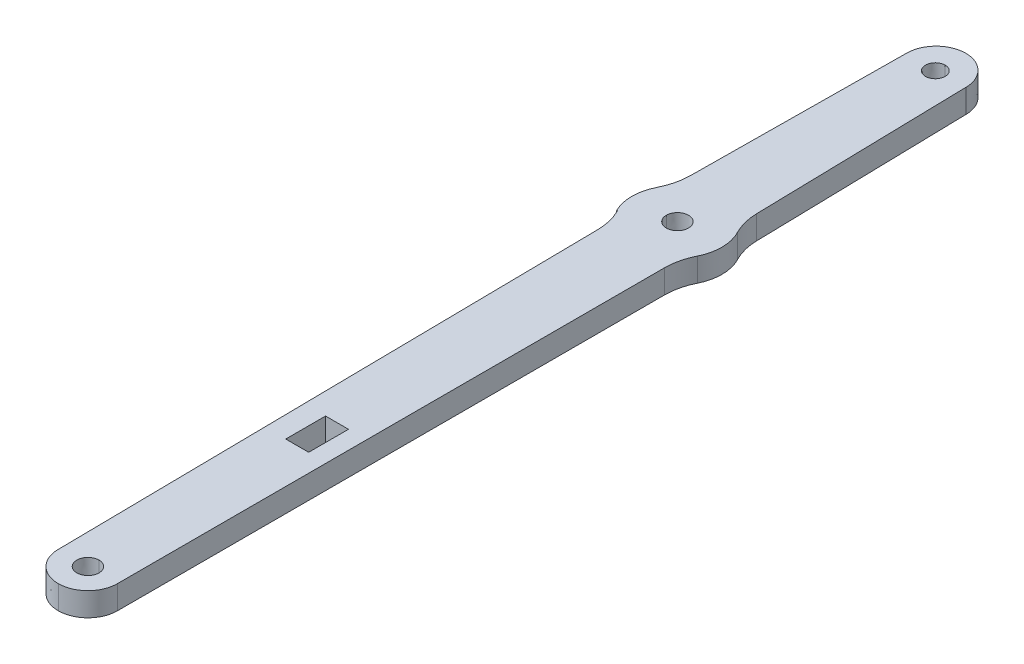
ISO-10303-21;
HEADER;
FILE_DESCRIPTION(('STEP AP214'),'2;1');
FILE_NAME('part.step','',(''),(''),'','','');
FILE_SCHEMA(('AUTOMOTIVE_DESIGN { 1 0 10303 214 1 1 1 1 }'));
ENDSEC;
DATA;
#1=APPLICATION_CONTEXT('core data for automotive mechanical design processes');
#2=APPLICATION_PROTOCOL_DEFINITION('international standard','automotive_design',2000,#1);
#3=PRODUCT_CONTEXT('',#1,'mechanical');
#4=PRODUCT('Part','Part','',(#3));
#5=PRODUCT_RELATED_PRODUCT_CATEGORY('part','',(#4));
#6=PRODUCT_DEFINITION_FORMATION('','',#4);
#7=PRODUCT_DEFINITION_CONTEXT('part definition',#1,'design');
#8=PRODUCT_DEFINITION('design','',#6,#7);
#9=PRODUCT_DEFINITION_SHAPE('','',#8);
#10=(LENGTH_UNIT() NAMED_UNIT(*) SI_UNIT(.MILLI.,.METRE.));
#11=(NAMED_UNIT(*) PLANE_ANGLE_UNIT() SI_UNIT($,.RADIAN.));
#12=(NAMED_UNIT(*) SI_UNIT($,.STERADIAN.) SOLID_ANGLE_UNIT());
#13=UNCERTAINTY_MEASURE_WITH_UNIT(LENGTH_MEASURE(1.E-05),#10,'distance_accuracy_value','');
#14=(GEOMETRIC_REPRESENTATION_CONTEXT(3) GLOBAL_UNCERTAINTY_ASSIGNED_CONTEXT((#13)) GLOBAL_UNIT_ASSIGNED_CONTEXT((#10,
#11,#12)) REPRESENTATION_CONTEXT('',''));
#15=CARTESIAN_POINT('',(0.,0.,0.));
#16=DIRECTION('',(0.,0.,1.));
#17=DIRECTION('',(1.,0.,0.));
#18=AXIS2_PLACEMENT_3D('',#15,#16,#17);
#19=CARTESIAN_POINT('',(10.4617957689132,3.175,-55.3022523212304));
#20=DIRECTION('',(0.,1.,0.));
#21=DIRECTION('',(0.,0.,1.));
#22=AXIS2_PLACEMENT_3D('',#19,#20,#21);
#23=PLANE('',#22);
#24=CARTESIAN_POINT('',(11.6719771861919,3.175,-52.5233345511014));
#25=CARTESIAN_POINT('',(11.6223956085443,3.175,-54.7068449331118));
#26=CARTESIAN_POINT('',(9.83383231610564,3.175,-56.4471215370803));
#27=CARTESIAN_POINT('',(7.65370519116398,3.175,-56.4327846081657));
#28=B_SPLINE_CURVE_WITH_KNOTS('',3,(#24,#25,#26,#27),.UNSPECIFIED.,.F.,.F.,(4,4),(17.,18.),.UNSPECIFIED.);
#29=CARTESIAN_POINT('',(11.6719771861919,3.175,-52.5233345511014));
#30=VERTEX_POINT('',#29);
#31=CARTESIAN_POINT('',(7.65370519116398,3.175,-56.4327846081657));
#32=VERTEX_POINT('',#31);
#33=EDGE_CURVE('E498',#30,#32,#28,.T.);
#34=ORIENTED_EDGE('',*,*,#33,.T.);
#35=CARTESIAN_POINT('',(7.65370519116398,3.175,-56.4327846081657));
#36=CARTESIAN_POINT('',(5.47344158527786,3.175,-56.418310951046));
#37=CARTESIAN_POINT('',(3.70786558334796,3.175,-54.6548100848465));
#38=CARTESIAN_POINT('',(3.68723746321296,3.175,-52.4707137248143));
#39=B_SPLINE_CURVE_WITH_KNOTS('',3,(#35,#36,#37,#38),.UNSPECIFIED.,.F.,.F.,(4,4),(16.,17.),.UNSPECIFIED.);
#40=CARTESIAN_POINT('',(3.68723746321296,3.175,-52.4707137248143));
#41=VERTEX_POINT('',#40);
#42=EDGE_CURVE('E600',#32,#41,#39,.T.);
#43=ORIENTED_EDGE('',*,*,#42,.T.);
#44=DIRECTION('',(0.,0.,1.));
#45=VECTOR('',#44,1.);
#46=CARTESIAN_POINT('',(3.68723746321296,3.175,-52.3707458737472));
#47=LINE('',#46,#45);
#48=CARTESIAN_POINT('',(3.68723746321296,3.175,-52.3707458737472));
#49=VERTEX_POINT('',#48);
#50=EDGE_CURVE('E556',#41,#49,#47,.T.);
#51=ORIENTED_EDGE('',*,*,#50,.T.);
#52=DIRECTION('',(-0.00950208528928577,0.,0.999954854168504));
#53=VECTOR('',#52,1.);
#54=CARTESIAN_POINT('',(3.4133981935645,3.175,-23.5531865054155));
#55=LINE('',#54,#53);
#56=CARTESIAN_POINT('',(3.4133981935645,3.175,-23.5531865054155));
#57=VERTEX_POINT('',#56);
#58=EDGE_CURVE('E575',#49,#57,#55,.T.);
#59=ORIENTED_EDGE('',*,*,#58,.T.);
#60=CARTESIAN_POINT('',(3.4133981935645,3.175,-23.5531865054155));
#61=CARTESIAN_POINT('',(3.40166083220464,3.175,-22.3292346719688));
#62=CARTESIAN_POINT('',(3.10986457083234,3.175,-21.1241708635412));
#63=CARTESIAN_POINT('',(2.56043127905739,3.175,-20.0309116622974));
#64=B_SPLINE_CURVE_WITH_KNOTS('',3,(#60,#61,#62,#63),.UNSPECIFIED.,.F.,.F.,(4,4),(13.,14.),.UNSPECIFIED.);
#65=CARTESIAN_POINT('',(2.56043127905739,3.175,-20.0309116622974));
#66=VERTEX_POINT('',#65);
#67=EDGE_CURVE('E572',#57,#66,#64,.T.);
#68=ORIENTED_EDGE('',*,*,#67,.T.);
#69=DIRECTION('',(-0.162157336830448,0.,0.986764915322822));
#70=VECTOR('',#69,1.);
#71=CARTESIAN_POINT('',(2.55097509926423,3.175,-19.9733686202417));
#72=LINE('',#71,#70);
#73=CARTESIAN_POINT('',(2.55097509926423,3.175,-19.9733686202417));
#74=VERTEX_POINT('',#73);
#75=EDGE_CURVE('E574',#66,#74,#72,.T.);
#76=ORIENTED_EDGE('',*,*,#75,.T.);
#77=CARTESIAN_POINT('',(2.55097509926423,3.175,-19.9733686202417));
#78=CARTESIAN_POINT('',(1.67135540592406,3.175,-18.2662974378113));
#79=CARTESIAN_POINT('',(1.66106084309277,3.175,-16.2404346771325));
#80=CARTESIAN_POINT('',(2.52330846165504,3.175,-14.5243394330384));
#81=B_SPLINE_CURVE_WITH_KNOTS('',3,(#77,#78,#79,#80),.UNSPECIFIED.,.F.,.F.,(4,4),(11.,12.),.UNSPECIFIED.);
#82=CARTESIAN_POINT('',(2.52330846165504,3.175,-14.5243394330384));
#83=VERTEX_POINT('',#82);
#84=EDGE_CURVE('E577',#74,#83,#81,.T.);
#85=ORIENTED_EDGE('',*,*,#84,.T.);
#86=DIRECTION('',(0.739716446301949,0.,-0.672918701679792));
#87=VECTOR('',#86,1.);
#88=CARTESIAN_POINT('',(2.58649913938934,3.175,-14.5818238772897));
#89=LINE('',#88,#87);
#90=CARTESIAN_POINT('',(2.58649913938934,3.175,-14.5818238772897));
#91=VERTEX_POINT('',#90);
#92=EDGE_CURVE('E671',#83,#91,#89,.T.);
#93=ORIENTED_EDGE('',*,*,#92,.T.);
#94=CARTESIAN_POINT('',(2.58649913938934,3.175,-14.5818238772897));
#95=CARTESIAN_POINT('',(3.15388942402711,3.175,-13.4796578100154));
#96=CARTESIAN_POINT('',(3.45792997582377,3.175,-12.2600617465402));
#97=CARTESIAN_POINT('',(3.4742297001078,3.175,-11.0199759848036));
#98=B_SPLINE_CURVE_WITH_KNOTS('',3,(#94,#95,#96,#97),.UNSPECIFIED.,.F.,.F.,(4,4),(9.,10.),.UNSPECIFIED.);
#99=CARTESIAN_POINT('',(3.4742297001078,3.175,-11.0199759848036));
#100=VERTEX_POINT('',#99);
#101=EDGE_CURVE('E667',#91,#100,#98,.T.);
#102=ORIENTED_EDGE('',*,*,#101,.T.);
#103=DIRECTION('',(0.0131254997991616,0.,0.999913856917196));
#104=VECTOR('',#103,1.);
#105=CARTESIAN_POINT('',(4.44221105359061,3.175,62.7218230624786));
#106=LINE('',#105,#104);
#107=CARTESIAN_POINT('',(4.44221105359061,3.175,62.7218230624786));
#108=VERTEX_POINT('',#107);
#109=EDGE_CURVE('E658',#100,#108,#106,.T.);
#110=ORIENTED_EDGE('',*,*,#109,.T.);
#111=CARTESIAN_POINT('',(4.44221105359061,3.175,62.7218230624786));
#112=CARTESIAN_POINT('',(4.47102803025527,3.175,64.9205688731367));
#113=CARTESIAN_POINT('',(6.2659084407377,3.175,66.6835130603737));
#114=CARTESIAN_POINT('',(8.46106796695403,3.175,66.6691761314601));
#115=B_SPLINE_CURVE_WITH_KNOTS('',3,(#111,#112,#113,#114),.UNSPECIFIED.,.F.,.F.,(4,4),(7.,8.),.UNSPECIFIED.);
#116=CARTESIAN_POINT('',(8.46106796695403,3.175,66.6691761314601));
#117=VERTEX_POINT('',#116);
#118=EDGE_CURVE('E653',#108,#117,#115,.T.);
#119=ORIENTED_EDGE('',*,*,#118,.T.);
#120=CARTESIAN_POINT('',(8.46106796695403,3.175,66.6691761314601));
#121=CARTESIAN_POINT('',(10.6560130231127,3.175,66.6546438765389));
#122=CARTESIAN_POINT('',(12.427594186643,3.175,64.8679578131496));
#123=CARTESIAN_POINT('',(12.4275941867411,3.175,62.6692120024908));
#124=B_SPLINE_CURVE_WITH_KNOTS('',3,(#120,#121,#122,#123),.UNSPECIFIED.,.F.,.F.,(4,4),(6.,7.),.UNSPECIFIED.);
#125=CARTESIAN_POINT('',(12.4275941867411,3.175,62.6692120024908));
#126=VERTEX_POINT('',#125);
#127=EDGE_CURVE('E649',#117,#126,#124,.T.);
#128=ORIENTED_EDGE('',*,*,#127,.T.);
#129=DIRECTION('',(4.48110086921921E-11,0.,-1.));
#130=VECTOR('',#129,1.);
#131=CARTESIAN_POINT('',(12.4275941900459,3.175,-11.0789937378206));
#132=LINE('',#131,#130);
#133=CARTESIAN_POINT('',(12.4275941900459,3.175,-11.0789937378207));
#134=VERTEX_POINT('',#133);
#135=EDGE_CURVE('E640',#126,#134,#132,.T.);
#136=ORIENTED_EDGE('',*,*,#135,.T.);
#137=CARTESIAN_POINT('',(12.4275941900459,3.175,-11.0789937378207));
#138=CARTESIAN_POINT('',(12.4275941901021,3.175,-12.3192064614615));
#139=CARTESIAN_POINT('',(12.7155299904475,3.175,-13.5423965234633));
#140=CARTESIAN_POINT('',(13.2684337976917,3.175,-14.6522193702141));
#141=B_SPLINE_CURVE_WITH_KNOTS('',3,(#137,#138,#139,#140),.UNSPECIFIED.,.F.,.F.,(4,4),(4.,5.),.UNSPECIFIED.);
#142=CARTESIAN_POINT('',(13.2684337976917,3.175,-14.6522193702141));
#143=VERTEX_POINT('',#142);
#144=EDGE_CURVE('E635',#134,#143,#141,.T.);
#145=ORIENTED_EDGE('',*,*,#144,.T.);
#146=CARTESIAN_POINT('',(13.2684337976917,3.175,-14.6522193702141));
#147=CARTESIAN_POINT('',(14.1250467030898,3.175,-16.371068710948));
#148=CARTESIAN_POINT('',(14.1081815577813,3.175,-18.3969314716282));
#149=CARTESIAN_POINT('',(13.2233170968341,3.175,-20.1013071552228));
#150=B_SPLINE_CURVE_WITH_KNOTS('',3,(#146,#147,#148,#149),.UNSPECIFIED.,.F.,.F.,(4,4),(3.,4.),.UNSPECIFIED.);
#151=CARTESIAN_POINT('',(13.2233170968341,3.175,-20.1013071552228));
#152=VERTEX_POINT('',#151);
#153=EDGE_CURVE('E391',#143,#152,#150,.T.);
#154=ORIENTED_EDGE('',*,*,#153,.T.);
#155=CARTESIAN_POINT('',(13.2233170968341,3.175,-20.1013071552228));
#156=CARTESIAN_POINT('',(12.6591828576069,3.175,-21.1871439682001));
#157=CARTESIAN_POINT('',(12.3516912876186,3.175,-22.3881840608827));
#158=CARTESIAN_POINT('',(12.3239661584745,3.175,-23.6119601009238));
#159=B_SPLINE_CURVE_WITH_KNOTS('',3,(#155,#156,#157,#158),.UNSPECIFIED.,.F.,.F.,(4,4),(2.,3.),.UNSPECIFIED.);
#160=CARTESIAN_POINT('',(12.3239661584748,3.175,-23.6119601009238));
#161=VERTEX_POINT('',#160);
#162=EDGE_CURVE('E384',#152,#161,#159,.T.);
#163=ORIENTED_EDGE('',*,*,#162,.T.);
#164=DIRECTION('',(-0.0226237052523794,0.,-0.999744051225439));
#165=VECTOR('',#164,1.);
#166=CARTESIAN_POINT('',(11.6719771861922,3.175,-52.4234252978365));
#167=LINE('',#166,#165);
#168=CARTESIAN_POINT('',(11.6719771861922,3.175,-52.4234252978365));
#169=VERTEX_POINT('',#168);
#170=EDGE_CURVE('E390',#161,#169,#167,.T.);
#171=ORIENTED_EDGE('',*,*,#170,.T.);
#172=DIRECTION('',(-3.61150215031958E-12,0.,-1.));
#173=VECTOR('',#172,1.);
#174=CARTESIAN_POINT('',(11.6719771861919,3.175,-52.5233345511014));
#175=LINE('',#174,#173);
#176=EDGE_CURVE('E401',#169,#30,#175,.T.);
#177=ORIENTED_EDGE('',*,*,#176,.T.);
#178=EDGE_LOOP('',(#34,#43,#51,#59,#68,#76,#85,#93,#102,#110,#119,#128,#136,#145,#154,#163,#171,#177));
#179=FACE_BOUND('',#178,.T.);
#180=CARTESIAN_POINT('',(7.90976294024558,3.175,-15.8320861238206));
#181=CARTESIAN_POINT('',(8.73668149129804,3.175,-15.8320861237834));
#182=CARTESIAN_POINT('',(9.40693941430926,3.175,-16.5037536686246));
#183=CARTESIAN_POINT('',(9.4069394143468,3.175,-17.3321508025868));
#184=CARTESIAN_POINT('',(9.406939414384,3.175,-18.1607041973553));
#185=CARTESIAN_POINT('',(8.73668149143182,3.175,-18.8321568836481));
#186=CARTESIAN_POINT('',(7.9096459567133,3.175,-18.8321568836857));
#187=CARTESIAN_POINT('',(7.08272740566047,3.175,-18.832156883722));
#188=CARTESIAN_POINT('',(6.41227450986905,3.175,-18.1607041974901));
#189=CARTESIAN_POINT('',(6.41246948261076,3.175,-17.3321508027212));
#190=B_SPLINE_CURVE_WITH_KNOTS('',3,(#180,#181,#182,#183,#184,#185,#186,#187,#188,#189),
.UNSPECIFIED.,.F.,.F.,(4,3,3,4),(1.,2.,3.,4.),.UNSPECIFIED.);
#191=CARTESIAN_POINT('',(7.90976294024558,3.175,-15.8320861238206));
#192=VERTEX_POINT('',#191);
#193=CARTESIAN_POINT('',(6.41246948261076,3.175,-17.3321508027212));
#194=VERTEX_POINT('',#193);
#195=EDGE_CURVE('E346',#192,#194,#190,.T.);
#196=ORIENTED_EDGE('',*,*,#195,.F.);
#197=CARTESIAN_POINT('',(6.41246948261076,3.175,-17.3321508027212));
#198=CARTESIAN_POINT('',(6.4124694825745,3.175,-16.5037536687593));
#199=CARTESIAN_POINT('',(7.08272740552604,3.175,-15.8320861238572));
#200=CARTESIAN_POINT('',(7.90976294024558,3.175,-15.8320861238206));
#201=B_SPLINE_CURVE_WITH_KNOTS('',3,(#197,#198,#199,#200),.UNSPECIFIED.,.F.,.F.,(4,4),(0.,1.),.UNSPECIFIED.);
#202=EDGE_CURVE('E339',#194,#192,#201,.T.);
#203=ORIENTED_EDGE('',*,*,#202,.F.);
#204=EDGE_LOOP('',(#196,#203));
#205=FACE_BOUND('',#204,.T.);
#206=CARTESIAN_POINT('',(7.67994852700389,3.175,-51.0077023895825));
#207=CARTESIAN_POINT('',(8.41033605508461,3.175,-51.0077023895501));
#208=CARTESIAN_POINT('',(9.00278034192312,3.175,-51.6009660746477));
#209=CARTESIAN_POINT('',(9.00278034195648,3.175,-52.3326573018817));
#210=CARTESIAN_POINT('',(9.0027803419892,3.175,-53.0643485291154));
#211=CARTESIAN_POINT('',(8.41033605520397,3.175,-53.6576708120697));
#212=CARTESIAN_POINT('',(7.67994852712292,3.175,-53.6576708121024));
#213=B_SPLINE_CURVE_WITH_KNOTS('',3,(#206,#207,#208,#209,#210,#211,#212),.UNSPECIFIED.,.F.,.F.,
(4,3,4),(2.,3.,4.),.UNSPECIFIED.);
#214=CARTESIAN_POINT('',(7.67994852700389,3.175,-51.0077023895825));
#215=VERTEX_POINT('',#214);
#216=CARTESIAN_POINT('',(7.67994852712292,3.175,-53.6576708121024));
#217=VERTEX_POINT('',#216);
#218=EDGE_CURVE('E302',#215,#217,#213,.T.);
#219=ORIENTED_EDGE('',*,*,#218,.F.);
#220=CARTESIAN_POINT('',(7.67994852712292,3.175,-53.6576708121024));
#221=CARTESIAN_POINT('',(6.949385523541,3.175,-53.6576708121357));
#222=CARTESIAN_POINT('',(6.3573896740939,3.175,-53.0643485292344));
#223=CARTESIAN_POINT('',(6.35738967406181,3.175,-52.3326573020004));
#224=CARTESIAN_POINT('',(6.35738967402845,3.175,-51.6009660747664));
#225=CARTESIAN_POINT('',(6.94938552342197,3.175,-51.0077023896155));
#226=CARTESIAN_POINT('',(7.67994852700389,3.175,-51.0077023895825));
#227=B_SPLINE_CURVE_WITH_KNOTS('',3,(#220,#221,#222,#223,#224,#225,#226),.UNSPECIFIED.,.F.,.F.,
(4,3,4),(0.,1.,2.),.UNSPECIFIED.);
#228=EDGE_CURVE('E308',#217,#215,#227,.T.);
#229=ORIENTED_EDGE('',*,*,#228,.F.);
#230=EDGE_LOOP('',(#219,#229));
#231=FACE_BOUND('',#230,.T.);
#232=CARTESIAN_POINT('',(8.43480513371031,3.175,64.1690911214381));
#233=CARTESIAN_POINT('',(9.26170418748441,3.175,64.1690911214747));
#234=CARTESIAN_POINT('',(9.93215708327586,3.175,63.4976286689415));
#235=CARTESIAN_POINT('',(9.93215708331244,3.175,62.6690264426716));
#236=CARTESIAN_POINT('',(9.93215708334964,3.175,61.8406097761093));
#237=CARTESIAN_POINT('',(9.26170418761917,3.175,61.1689519975068));
#238=CARTESIAN_POINT('',(8.43461016106517,3.175,61.1691473234779));
#239=B_SPLINE_CURVE_WITH_KNOTS('',3,(#232,#233,#234,#235,#236,#237,#238),.UNSPECIFIED.,.F.,.F.,
(4,3,4),(2.,3.,4.),.UNSPECIFIED.);
#240=CARTESIAN_POINT('',(8.43480513371031,3.175,64.1690911214381));
#241=VERTEX_POINT('',#240);
#242=CARTESIAN_POINT('',(8.43461016106517,3.175,61.1691473234779));
#243=VERTEX_POINT('',#242);
#244=EDGE_CURVE('E277',#241,#243,#239,.T.);
#245=ORIENTED_EDGE('',*,*,#244,.F.);
#246=CARTESIAN_POINT('',(8.43461016106517,3.175,61.1691473234779));
#247=CARTESIAN_POINT('',(7.60769161001301,3.175,61.1691473234413));
#248=CARTESIAN_POINT('',(6.93725821150025,3.175,61.8406097759738));
#249=CARTESIAN_POINT('',(6.93725821146239,3.175,62.6692120022451));
#250=CARTESIAN_POINT('',(6.93725821142582,3.175,63.4976286688074));
#251=CARTESIAN_POINT('',(7.60769160987923,3.175,64.1692180833057));
#252=CARTESIAN_POINT('',(8.43480513371031,3.175,64.1690911214381));
#253=B_SPLINE_CURVE_WITH_KNOTS('',3,(#246,#247,#248,#249,#250,#251,#252),.UNSPECIFIED.,.F.,.F.,
(4,3,4),(0.,1.,2.),.UNSPECIFIED.);
#254=EDGE_CURVE('E271',#243,#241,#253,.T.);
#255=ORIENTED_EDGE('',*,*,#254,.F.);
#256=EDGE_LOOP('',(#245,#255));
#257=FACE_BOUND('',#256,.T.);
#258=DIRECTION('',(0.,0.,-1.));
#259=VECTOR('',#258,1.);
#260=CARTESIAN_POINT('',(9.98179715415615,3.175,34.4577297051702));
#261=LINE('',#260,#259);
#262=CARTESIAN_POINT('',(9.98179715415615,3.175,34.4577297051702));
#263=VERTEX_POINT('',#262);
#264=CARTESIAN_POINT('',(9.98179715415615,3.175,29.0841744875876));
#265=VERTEX_POINT('',#264);
#266=EDGE_CURVE('E243',#263,#265,#261,.T.);
#267=ORIENTED_EDGE('',*,*,#266,.F.);
#268=DIRECTION('',(1.,0.,0.));
#269=VECTOR('',#268,1.);
#270=CARTESIAN_POINT('',(6.8876766349818,3.175,34.4577297051702));
#271=LINE('',#270,#269);
#272=CARTESIAN_POINT('',(6.8876766349818,3.175,34.4577297051702));
#273=VERTEX_POINT('',#272);
#274=EDGE_CURVE('E235',#273,#263,#271,.T.);
#275=ORIENTED_EDGE('',*,*,#274,.F.);
#276=DIRECTION('',(0.,0.,1.));
#277=VECTOR('',#276,1.);
#278=CARTESIAN_POINT('',(6.8876766349818,3.175,29.0841744875876));
#279=LINE('',#278,#277);
#280=CARTESIAN_POINT('',(6.8876766349818,3.175,29.0841744875876));
#281=VERTEX_POINT('',#280);
#282=EDGE_CURVE('E257',#281,#273,#279,.T.);
#283=ORIENTED_EDGE('',*,*,#282,.F.);
#284=DIRECTION('',(-1.,0.,0.));
#285=VECTOR('',#284,1.);
#286=CARTESIAN_POINT('',(9.98179715415615,3.175,29.0841744875876));
#287=LINE('',#286,#285);
#288=EDGE_CURVE('E255',#265,#281,#287,.T.);
#289=ORIENTED_EDGE('',*,*,#288,.F.);
#290=EDGE_LOOP('',(#267,#275,#283,#289));
#291=FACE_BOUND('',#290,.T.);
#292=ADVANCED_FACE('F39',(#179,#205,#231,#257,#291),#23,.T.);
#293=CARTESIAN_POINT('',(10.4617957689132,0.,-55.3022523212304));
#294=DIRECTION('',(0.,1.,0.));
#295=DIRECTION('',(0.,0.,1.));
#296=AXIS2_PLACEMENT_3D('',#293,#294,#295);
#297=PLANE('',#296);
#298=CARTESIAN_POINT('',(8.43461016106517,0.,61.1691473234779));
#299=CARTESIAN_POINT('',(7.60769161001301,0.,61.1691473234413));
#300=CARTESIAN_POINT('',(6.93725821150025,0.,61.8406097759738));
#301=CARTESIAN_POINT('',(6.93725821146239,0.,62.6692120022451));
#302=CARTESIAN_POINT('',(6.93725821142582,0.,63.4976286688074));
#303=CARTESIAN_POINT('',(7.60769160987923,0.,64.1692180833057));
#304=CARTESIAN_POINT('',(8.43480513371031,0.,64.1690911214381));
#305=B_SPLINE_CURVE_WITH_KNOTS('',3,(#298,#299,#300,#301,#302,#303,#304),.UNSPECIFIED.,.F.,.F.,
(4,3,4),(0.,1.,2.),.UNSPECIFIED.);
#306=CARTESIAN_POINT('',(8.43461016106517,0.,61.1691473234779));
#307=VERTEX_POINT('',#306);
#308=CARTESIAN_POINT('',(8.43480513371031,0.,64.1690911214381));
#309=VERTEX_POINT('',#308);
#310=EDGE_CURVE('E251',#307,#309,#305,.T.);
#311=ORIENTED_EDGE('',*,*,#310,.T.);
#312=CARTESIAN_POINT('',(8.43480513371031,0.,64.1690911214381));
#313=CARTESIAN_POINT('',(9.26170418748441,0.,64.1690911214747));
#314=CARTESIAN_POINT('',(9.93215708327586,0.,63.4976286689415));
#315=CARTESIAN_POINT('',(9.93215708331244,0.,62.6690264426716));
#316=CARTESIAN_POINT('',(9.93215708334964,0.,61.8406097761093));
#317=CARTESIAN_POINT('',(9.26170418761917,0.,61.1689519975068));
#318=CARTESIAN_POINT('',(8.43461016106517,0.,61.1691473234779));
#319=B_SPLINE_CURVE_WITH_KNOTS('',3,(#312,#313,#314,#315,#316,#317,#318),.UNSPECIFIED.,.F.,.F.,
(4,3,4),(2.,3.,4.),.UNSPECIFIED.);
#320=EDGE_CURVE('E278',#309,#307,#319,.T.);
#321=ORIENTED_EDGE('',*,*,#320,.T.);
#322=EDGE_LOOP('',(#311,#321));
#323=FACE_BOUND('',#322,.T.);
#324=CARTESIAN_POINT('',(6.41246948261076,0.,-17.3321508027212));
#325=CARTESIAN_POINT('',(6.4124694825745,0.,-16.5037536687593));
#326=CARTESIAN_POINT('',(7.08272740552604,0.,-15.8320861238572));
#327=CARTESIAN_POINT('',(7.90976294024558,0.,-15.8320861238206));
#328=B_SPLINE_CURVE_WITH_KNOTS('',3,(#324,#325,#326,#327),.UNSPECIFIED.,.F.,.F.,(4,4),(0.,1.),.UNSPECIFIED.);
#329=CARTESIAN_POINT('',(6.41246948261076,0.,-17.3321508027212));
#330=VERTEX_POINT('',#329);
#331=CARTESIAN_POINT('',(7.90976294024558,0.,-15.8320861238206));
#332=VERTEX_POINT('',#331);
#333=EDGE_CURVE('E338',#330,#332,#328,.T.);
#334=ORIENTED_EDGE('',*,*,#333,.T.);
#335=CARTESIAN_POINT('',(7.90976294024558,0.,-15.8320861238206));
#336=CARTESIAN_POINT('',(8.73668149129804,0.,-15.8320861237834));
#337=CARTESIAN_POINT('',(9.40693941430926,0.,-16.5037536686246));
#338=CARTESIAN_POINT('',(9.4069394143468,0.,-17.3321508025868));
#339=CARTESIAN_POINT('',(9.406939414384,0.,-18.1607041973553));
#340=CARTESIAN_POINT('',(8.73668149143182,0.,-18.8321568836481));
#341=CARTESIAN_POINT('',(7.9096459567133,0.,-18.8321568836857));
#342=CARTESIAN_POINT('',(7.08272740566047,0.,-18.832156883722));
#343=CARTESIAN_POINT('',(6.41227450986905,0.,-18.1607041974901));
#344=CARTESIAN_POINT('',(6.41246948261076,0.,-17.3321508027212));
#345=B_SPLINE_CURVE_WITH_KNOTS('',3,(#335,#336,#337,#338,#339,#340,#341,#342,#343,#344),
.UNSPECIFIED.,.F.,.F.,(4,3,3,4),(1.,2.,3.,4.),.UNSPECIFIED.);
#346=EDGE_CURVE('E347',#332,#330,#345,.T.);
#347=ORIENTED_EDGE('',*,*,#346,.T.);
#348=EDGE_LOOP('',(#334,#347));
#349=FACE_BOUND('',#348,.T.);
#350=CARTESIAN_POINT('',(11.6719771861919,0.,-52.5233345511014));
#351=CARTESIAN_POINT('',(11.6223956085443,0.,-54.7068449331118));
#352=CARTESIAN_POINT('',(9.83383231610564,0.,-56.4471215370803));
#353=CARTESIAN_POINT('',(7.65370519116398,0.,-56.4327846081657));
#354=B_SPLINE_CURVE_WITH_KNOTS('',3,(#350,#351,#352,#353),.UNSPECIFIED.,.F.,.F.,(4,4),(17.,18.),.UNSPECIFIED.);
#355=CARTESIAN_POINT('',(11.6719771861919,0.,-52.5233345511014));
#356=VERTEX_POINT('',#355);
#357=CARTESIAN_POINT('',(7.65370519116398,0.,-56.4327846081657));
#358=VERTEX_POINT('',#357);
#359=EDGE_CURVE('E404',#356,#358,#354,.T.);
#360=ORIENTED_EDGE('',*,*,#359,.F.);
#361=DIRECTION('',(-3.61150215031958E-12,0.,-1.));
#362=VECTOR('',#361,1.);
#363=CARTESIAN_POINT('',(11.6719771861919,0.,-52.5233345511014));
#364=LINE('',#363,#362);
#365=CARTESIAN_POINT('',(11.6719771861922,0.,-52.4234252978365));
#366=VERTEX_POINT('',#365);
#367=EDGE_CURVE('E496',#366,#356,#364,.T.);
#368=ORIENTED_EDGE('',*,*,#367,.F.);
#369=DIRECTION('',(-0.0226237052523794,0.,-0.999744051225439));
#370=VECTOR('',#369,1.);
#371=CARTESIAN_POINT('',(11.6719771861922,0.,-52.4234252978365));
#372=LINE('',#371,#370);
#373=CARTESIAN_POINT('',(12.3239661584748,0.,-23.6119601009238));
#374=VERTEX_POINT('',#373);
#375=EDGE_CURVE('E490',#374,#366,#372,.T.);
#376=ORIENTED_EDGE('',*,*,#375,.F.);
#377=CARTESIAN_POINT('',(13.2233170968341,0.,-20.1013071552228));
#378=CARTESIAN_POINT('',(12.6591828576069,0.,-21.1871439682001));
#379=CARTESIAN_POINT('',(12.3516912876186,0.,-22.3881840608827));
#380=CARTESIAN_POINT('',(12.3239661584745,0.,-23.6119601009238));
#381=B_SPLINE_CURVE_WITH_KNOTS('',3,(#377,#378,#379,#380),.UNSPECIFIED.,.F.,.F.,(4,4),(2.,3.),.UNSPECIFIED.);
#382=CARTESIAN_POINT('',(13.2233170968341,0.,-20.1013071552228));
#383=VERTEX_POINT('',#382);
#384=EDGE_CURVE('E482',#383,#374,#381,.T.);
#385=ORIENTED_EDGE('',*,*,#384,.F.);
#386=CARTESIAN_POINT('',(13.2684337976917,0.,-14.6522193702141));
#387=CARTESIAN_POINT('',(14.1250467030898,0.,-16.371068710948));
#388=CARTESIAN_POINT('',(14.1081815577813,0.,-18.3969314716282));
#389=CARTESIAN_POINT('',(13.2233170968341,0.,-20.1013071552228));
#390=B_SPLINE_CURVE_WITH_KNOTS('',3,(#386,#387,#388,#389),.UNSPECIFIED.,.F.,.F.,(4,4),(3.,4.),.UNSPECIFIED.);
#391=CARTESIAN_POINT('',(13.2684337976917,0.,-14.6522193702141));
#392=VERTEX_POINT('',#391);
#393=EDGE_CURVE('E474',#392,#383,#390,.T.);
#394=ORIENTED_EDGE('',*,*,#393,.F.);
#395=CARTESIAN_POINT('',(12.4275941900459,0.,-11.0789937378207));
#396=CARTESIAN_POINT('',(12.4275941901021,0.,-12.3192064614615));
#397=CARTESIAN_POINT('',(12.7155299904475,0.,-13.5423965234633));
#398=CARTESIAN_POINT('',(13.2684337976917,0.,-14.6522193702141));
#399=B_SPLINE_CURVE_WITH_KNOTS('',3,(#395,#396,#397,#398),.UNSPECIFIED.,.F.,.F.,(4,4),(4.,5.),.UNSPECIFIED.);
#400=CARTESIAN_POINT('',(12.4275941900459,0.,-11.0789937378207));
#401=VERTEX_POINT('',#400);
#402=EDGE_CURVE('E469',#401,#392,#399,.T.);
#403=ORIENTED_EDGE('',*,*,#402,.F.);
#404=DIRECTION('',(4.48110086921921E-11,0.,-1.));
#405=VECTOR('',#404,1.);
#406=CARTESIAN_POINT('',(12.4275941900459,0.,-11.0789937378206));
#407=LINE('',#406,#405);
#408=CARTESIAN_POINT('',(12.4275941867411,0.,62.6692120024908));
#409=VERTEX_POINT('',#408);
#410=EDGE_CURVE('E463',#409,#401,#407,.T.);
#411=ORIENTED_EDGE('',*,*,#410,.F.);
#412=CARTESIAN_POINT('',(8.46106796695403,0.,66.6691761314601));
#413=CARTESIAN_POINT('',(10.6560130231127,0.,66.6546438765389));
#414=CARTESIAN_POINT('',(12.427594186643,0.,64.8679578131496));
#415=CARTESIAN_POINT('',(12.4275941867411,0.,62.6692120024908));
#416=B_SPLINE_CURVE_WITH_KNOTS('',3,(#412,#413,#414,#415),.UNSPECIFIED.,.F.,.F.,(4,4),(6.,7.),.UNSPECIFIED.);
#417=CARTESIAN_POINT('',(8.46106796695403,0.,66.6691761314601));
#418=VERTEX_POINT('',#417);
#419=EDGE_CURVE('E456',#418,#409,#416,.T.);
#420=ORIENTED_EDGE('',*,*,#419,.F.);
#421=CARTESIAN_POINT('',(4.44221105359061,0.,62.7218230624786));
#422=CARTESIAN_POINT('',(4.47102803025527,0.,64.9205688731367));
#423=CARTESIAN_POINT('',(6.2659084407377,0.,66.6835130603737));
#424=CARTESIAN_POINT('',(8.46106796695403,0.,66.6691761314601));
#425=B_SPLINE_CURVE_WITH_KNOTS('',3,(#421,#422,#423,#424),.UNSPECIFIED.,.F.,.F.,(4,4),(7.,8.),.UNSPECIFIED.);
#426=CARTESIAN_POINT('',(4.44221105359061,0.,62.7218230624786));
#427=VERTEX_POINT('',#426);
#428=EDGE_CURVE('E452',#427,#418,#425,.T.);
#429=ORIENTED_EDGE('',*,*,#428,.F.);
#430=DIRECTION('',(0.0131254997991616,0.,0.999913856917196));
#431=VECTOR('',#430,1.);
#432=CARTESIAN_POINT('',(4.44221105359061,0.,62.7218230624786));
#433=LINE('',#432,#431);
#434=CARTESIAN_POINT('',(3.4742297001078,0.,-11.0199759848036));
#435=VERTEX_POINT('',#434);
#436=EDGE_CURVE('E446',#435,#427,#433,.T.);
#437=ORIENTED_EDGE('',*,*,#436,.F.);
#438=CARTESIAN_POINT('',(2.58649913938934,0.,-14.5818238772897));
#439=CARTESIAN_POINT('',(3.15388942402711,0.,-13.4796578100154));
#440=CARTESIAN_POINT('',(3.45792997582377,0.,-12.2600617465402));
#441=CARTESIAN_POINT('',(3.4742297001078,0.,-11.0199759848036));
#442=B_SPLINE_CURVE_WITH_KNOTS('',3,(#438,#439,#440,#441),.UNSPECIFIED.,.F.,.F.,(4,4),(9.,10.),.UNSPECIFIED.);
#443=CARTESIAN_POINT('',(2.58649913938934,0.,-14.5818238772897));
#444=VERTEX_POINT('',#443);
#445=EDGE_CURVE('E442',#444,#435,#442,.T.);
#446=ORIENTED_EDGE('',*,*,#445,.F.);
#447=DIRECTION('',(0.739716446301949,0.,-0.672918701679792));
#448=VECTOR('',#447,1.);
#449=CARTESIAN_POINT('',(2.58649913938934,0.,-14.5818238772897));
#450=LINE('',#449,#448);
#451=CARTESIAN_POINT('',(2.52330846165504,0.,-14.5243394330384));
#452=VERTEX_POINT('',#451);
#453=EDGE_CURVE('E437',#452,#444,#450,.T.);
#454=ORIENTED_EDGE('',*,*,#453,.F.);
#455=CARTESIAN_POINT('',(2.55097509926423,0.,-19.9733686202417));
#456=CARTESIAN_POINT('',(1.67135540592406,0.,-18.2662974378113));
#457=CARTESIAN_POINT('',(1.66106084309277,0.,-16.2404346771325));
#458=CARTESIAN_POINT('',(2.52330846165504,0.,-14.5243394330384));
#459=B_SPLINE_CURVE_WITH_KNOTS('',3,(#455,#456,#457,#458),.UNSPECIFIED.,.F.,.F.,(4,4),(11.,12.),.UNSPECIFIED.);
#460=CARTESIAN_POINT('',(2.55097509926423,0.,-19.9733686202417));
#461=VERTEX_POINT('',#460);
#462=EDGE_CURVE('E433',#461,#452,#459,.T.);
#463=ORIENTED_EDGE('',*,*,#462,.F.);
#464=DIRECTION('',(-0.162157336830448,0.,0.986764915322822));
#465=VECTOR('',#464,1.);
#466=CARTESIAN_POINT('',(2.55097509926423,0.,-19.9733686202417));
#467=LINE('',#466,#465);
#468=CARTESIAN_POINT('',(2.56043127905739,0.,-20.0309116622974));
#469=VERTEX_POINT('',#468);
#470=EDGE_CURVE('E428',#469,#461,#467,.T.);
#471=ORIENTED_EDGE('',*,*,#470,.F.);
#472=CARTESIAN_POINT('',(3.4133981935645,0.,-23.5531865054155));
#473=CARTESIAN_POINT('',(3.40166083220464,0.,-22.3292346719688));
#474=CARTESIAN_POINT('',(3.10986457083234,0.,-21.1241708635412));
#475=CARTESIAN_POINT('',(2.56043127905739,0.,-20.0309116622974));
#476=B_SPLINE_CURVE_WITH_KNOTS('',3,(#472,#473,#474,#475),.UNSPECIFIED.,.F.,.F.,(4,4),(13.,14.),.UNSPECIFIED.);
#477=CARTESIAN_POINT('',(3.4133981935645,0.,-23.5531865054155));
#478=VERTEX_POINT('',#477);
#479=EDGE_CURVE('E424',#478,#469,#476,.T.);
#480=ORIENTED_EDGE('',*,*,#479,.F.);
#481=DIRECTION('',(-0.00950208528928577,0.,0.999954854168504));
#482=VECTOR('',#481,1.);
#483=CARTESIAN_POINT('',(3.4133981935645,0.,-23.5531865054155));
#484=LINE('',#483,#482);
#485=CARTESIAN_POINT('',(3.68723746321296,0.,-52.3707458737472));
#486=VERTEX_POINT('',#485);
#487=EDGE_CURVE('E422',#486,#478,#484,.T.);
#488=ORIENTED_EDGE('',*,*,#487,.F.);
#489=DIRECTION('',(0.,0.,1.));
#490=VECTOR('',#489,1.);
#491=CARTESIAN_POINT('',(3.68723746321296,0.,-52.3707458737472));
#492=LINE('',#491,#490);
#493=CARTESIAN_POINT('',(3.68723746321296,0.,-52.4707137248143));
#494=VERTEX_POINT('',#493);
#495=EDGE_CURVE('E417',#494,#486,#492,.T.);
#496=ORIENTED_EDGE('',*,*,#495,.F.);
#497=CARTESIAN_POINT('',(7.65370519116398,0.,-56.4327846081657));
#498=CARTESIAN_POINT('',(5.47344158527786,0.,-56.418310951046));
#499=CARTESIAN_POINT('',(3.70786558334796,0.,-54.6548100848465));
#500=CARTESIAN_POINT('',(3.68723746321296,0.,-52.4707137248143));
#501=B_SPLINE_CURVE_WITH_KNOTS('',3,(#497,#498,#499,#500),.UNSPECIFIED.,.F.,.F.,(4,4),(16.,17.),.UNSPECIFIED.);
#502=EDGE_CURVE('E409',#358,#494,#501,.T.);
#503=ORIENTED_EDGE('',*,*,#502,.F.);
#504=EDGE_LOOP('',(#360,#368,#376,#385,#394,#403,#411,#420,#429,#437,#446,#454,#463,#471,#480,
#488,#496,#503));
#505=FACE_BOUND('',#504,.T.);
#506=CARTESIAN_POINT('',(7.67994852712292,0.,-53.6576708121024));
#507=CARTESIAN_POINT('',(6.949385523541,0.,-53.6576708121357));
#508=CARTESIAN_POINT('',(6.3573896740939,0.,-53.0643485292344));
#509=CARTESIAN_POINT('',(6.35738967406181,0.,-52.3326573020004));
#510=CARTESIAN_POINT('',(6.35738967402845,0.,-51.6009660747664));
#511=CARTESIAN_POINT('',(6.94938552342197,0.,-51.0077023896155));
#512=CARTESIAN_POINT('',(7.67994852700389,0.,-51.0077023895825));
#513=B_SPLINE_CURVE_WITH_KNOTS('',3,(#506,#507,#508,#509,#510,#511,#512),.UNSPECIFIED.,.F.,.F.,
(4,3,4),(0.,1.,2.),.UNSPECIFIED.);
#514=CARTESIAN_POINT('',(7.67994852712292,0.,-53.6576708121024));
#515=VERTEX_POINT('',#514);
#516=CARTESIAN_POINT('',(7.67994852700389,0.,-51.0077023895825));
#517=VERTEX_POINT('',#516);
#518=EDGE_CURVE('E313',#515,#517,#513,.T.);
#519=ORIENTED_EDGE('',*,*,#518,.T.);
#520=CARTESIAN_POINT('',(7.67994852700389,0.,-51.0077023895825));
#521=CARTESIAN_POINT('',(8.41033605508461,0.,-51.0077023895501));
#522=CARTESIAN_POINT('',(9.00278034192312,0.,-51.6009660746477));
#523=CARTESIAN_POINT('',(9.00278034195648,0.,-52.3326573018817));
#524=CARTESIAN_POINT('',(9.0027803419892,0.,-53.0643485291154));
#525=CARTESIAN_POINT('',(8.41033605520397,0.,-53.6576708120697));
#526=CARTESIAN_POINT('',(7.67994852712292,0.,-53.6576708121024));
#527=B_SPLINE_CURVE_WITH_KNOTS('',3,(#520,#521,#522,#523,#524,#525,#526),.UNSPECIFIED.,.F.,.F.,
(4,3,4),(2.,3.,4.),.UNSPECIFIED.);
#528=EDGE_CURVE('E321',#517,#515,#527,.T.);
#529=ORIENTED_EDGE('',*,*,#528,.T.);
#530=EDGE_LOOP('',(#519,#529));
#531=FACE_BOUND('',#530,.T.);
#532=DIRECTION('',(1.,0.,0.));
#533=VECTOR('',#532,1.);
#534=CARTESIAN_POINT('',(6.8876766349818,0.,34.4577297051702));
#535=LINE('',#534,#533);
#536=CARTESIAN_POINT('',(6.8876766349818,0.,34.4577297051702));
#537=VERTEX_POINT('',#536);
#538=CARTESIAN_POINT('',(9.98179715415615,0.,34.4577297051702));
#539=VERTEX_POINT('',#538);
#540=EDGE_CURVE('E63',#537,#539,#535,.T.);
#541=ORIENTED_EDGE('',*,*,#540,.T.);
#542=DIRECTION('',(0.,0.,-1.));
#543=VECTOR('',#542,1.);
#544=CARTESIAN_POINT('',(9.98179715415615,0.,34.4577297051702));
#545=LINE('',#544,#543);
#546=CARTESIAN_POINT('',(9.98179715415615,0.,29.0841744875876));
#547=VERTEX_POINT('',#546);
#548=EDGE_CURVE('E250',#539,#547,#545,.T.);
#549=ORIENTED_EDGE('',*,*,#548,.T.);
#550=DIRECTION('',(-1.,0.,0.));
#551=VECTOR('',#550,1.);
#552=CARTESIAN_POINT('',(9.98179715415615,0.,29.0841744875876));
#553=LINE('',#552,#551);
#554=CARTESIAN_POINT('',(6.8876766349818,0.,29.0841744875876));
#555=VERTEX_POINT('',#554);
#556=EDGE_CURVE('E263',#547,#555,#553,.T.);
#557=ORIENTED_EDGE('',*,*,#556,.T.);
#558=DIRECTION('',(0.,0.,1.));
#559=VECTOR('',#558,1.);
#560=CARTESIAN_POINT('',(6.8876766349818,0.,29.0841744875876));
#561=LINE('',#560,#559);
#562=EDGE_CURVE('E244',#555,#537,#561,.T.);
#563=ORIENTED_EDGE('',*,*,#562,.T.);
#564=EDGE_LOOP('',(#541,#549,#557,#563));
#565=FACE_BOUND('',#564,.T.);
#566=ADVANCED_FACE('F364',(#323,#349,#505,#531,#565),#297,.F.);
#567=DIRECTION('',(0.,-1.,0.));
#568=VECTOR('',#567,1.);
#569=SURFACE_OF_LINEAR_EXTRUSION('',#28,#568);
#570=ORIENTED_EDGE('',*,*,#359,.T.);
#571=DIRECTION('',(0.,-1.,0.));
#572=VECTOR('',#571,1.);
#573=CARTESIAN_POINT('',(7.65370519116398,3.175,-56.4327846081657));
#574=LINE('',#573,#572);
#575=EDGE_CURVE('E11',#32,#358,#574,.T.);
#576=ORIENTED_EDGE('',*,*,#575,.F.);
#577=ORIENTED_EDGE('',*,*,#33,.F.);
#578=DIRECTION('',(0.,-1.,0.));
#579=VECTOR('',#578,1.);
#580=CARTESIAN_POINT('',(11.6719771861919,3.175,-52.5233345511014));
#581=LINE('',#580,#579);
#582=EDGE_CURVE('E403',#30,#356,#581,.T.);
#583=ORIENTED_EDGE('',*,*,#582,.T.);
#584=EDGE_LOOP('',(#570,#576,#577,#583));
#585=FACE_BOUND('',#584,.T.);
#586=ADVANCED_FACE('F41',(#585),#569,.F.);
#587=DIRECTION('',(0.,-1.,0.));
#588=VECTOR('',#587,1.);
#589=SURFACE_OF_LINEAR_EXTRUSION('',#39,#588);
#590=ORIENTED_EDGE('',*,*,#502,.T.);
#591=DIRECTION('',(0.,-1.,0.));
#592=VECTOR('',#591,1.);
#593=CARTESIAN_POINT('',(3.68723746321296,3.175,-52.4707137248143));
#594=LINE('',#593,#592);
#595=EDGE_CURVE('E48',#41,#494,#594,.T.);
#596=ORIENTED_EDGE('',*,*,#595,.F.);
#597=ORIENTED_EDGE('',*,*,#42,.F.);
#598=ORIENTED_EDGE('',*,*,#575,.T.);
#599=EDGE_LOOP('',(#590,#596,#597,#598));
#600=FACE_BOUND('',#599,.T.);
#601=ADVANCED_FACE('F597',(#600),#589,.F.);
#602=CARTESIAN_POINT('',(3.68723746321296,3.175,-52.3707458737472));
#603=DIRECTION('',(1.,0.,0.));
#604=DIRECTION('',(0.,0.,-1.));
#605=AXIS2_PLACEMENT_3D('',#602,#603,#604);
#606=PLANE('',#605);
#607=ORIENTED_EDGE('',*,*,#495,.T.);
#608=DIRECTION('',(0.,-1.,0.));
#609=VECTOR('',#608,1.);
#610=CARTESIAN_POINT('',(3.68723746321296,3.175,-52.3707458737472));
#611=LINE('',#610,#609);
#612=EDGE_CURVE('E547',#49,#486,#611,.T.);
#613=ORIENTED_EDGE('',*,*,#612,.F.);
#614=ORIENTED_EDGE('',*,*,#50,.F.);
#615=ORIENTED_EDGE('',*,*,#595,.T.);
#616=EDGE_LOOP('',(#607,#613,#614,#615));
#617=FACE_BOUND('',#616,.T.);
#618=ADVANCED_FACE('F554',(#617),#606,.F.);
#619=CARTESIAN_POINT('',(3.4133981935645,3.175,-23.5531865054155));
#620=DIRECTION('',(0.999954854168504,0.,0.00950208528928577));
#621=DIRECTION('',(0.00950208528928577,0.,-0.999954854168505));
#622=AXIS2_PLACEMENT_3D('',#619,#620,#621);
#623=PLANE('',#622);
#624=ORIENTED_EDGE('',*,*,#487,.T.);
#625=DIRECTION('',(0.,-1.,0.));
#626=VECTOR('',#625,1.);
#627=CARTESIAN_POINT('',(3.4133981935645,3.175,-23.5531865054155));
#628=LINE('',#627,#626);
#629=EDGE_CURVE('E544',#57,#478,#628,.T.);
#630=ORIENTED_EDGE('',*,*,#629,.F.);
#631=ORIENTED_EDGE('',*,*,#58,.F.);
#632=ORIENTED_EDGE('',*,*,#612,.T.);
#633=EDGE_LOOP('',(#624,#630,#631,#632));
#634=FACE_BOUND('',#633,.T.);
#635=ADVANCED_FACE('F566',(#634),#623,.F.);
#636=DIRECTION('',(0.,-1.,0.));
#637=VECTOR('',#636,1.);
#638=SURFACE_OF_LINEAR_EXTRUSION('',#64,#637);
#639=ORIENTED_EDGE('',*,*,#479,.T.);
#640=DIRECTION('',(0.,-1.,0.));
#641=VECTOR('',#640,1.);
#642=CARTESIAN_POINT('',(2.56043127905739,3.175,-20.0309116622974));
#643=LINE('',#642,#641);
#644=EDGE_CURVE('E541',#66,#469,#643,.T.);
#645=ORIENTED_EDGE('',*,*,#644,.F.);
#646=ORIENTED_EDGE('',*,*,#67,.F.);
#647=ORIENTED_EDGE('',*,*,#629,.T.);
#648=EDGE_LOOP('',(#639,#645,#646,#647));
#649=FACE_BOUND('',#648,.T.);
#650=ADVANCED_FACE('F570',(#649),#638,.F.);
#651=CARTESIAN_POINT('',(2.55097509926423,3.175,-19.9733686202417));
#652=DIRECTION('',(0.986764915322822,0.,0.162157336830448));
#653=DIRECTION('',(0.162157336830448,0.,-0.986764915322822));
#654=AXIS2_PLACEMENT_3D('',#651,#652,#653);
#655=PLANE('',#654);
#656=ORIENTED_EDGE('',*,*,#470,.T.);
#657=DIRECTION('',(0.,-1.,0.));
#658=VECTOR('',#657,1.);
#659=CARTESIAN_POINT('',(2.55097509926423,3.175,-19.9733686202417));
#660=LINE('',#659,#658);
#661=EDGE_CURVE('E538',#74,#461,#660,.T.);
#662=ORIENTED_EDGE('',*,*,#661,.F.);
#663=ORIENTED_EDGE('',*,*,#75,.F.);
#664=ORIENTED_EDGE('',*,*,#644,.T.);
#665=EDGE_LOOP('',(#656,#662,#663,#664));
#666=FACE_BOUND('',#665,.T.);
#667=ADVANCED_FACE('F592',(#666),#655,.F.);
#668=DIRECTION('',(0.,-1.,0.));
#669=VECTOR('',#668,1.);
#670=SURFACE_OF_LINEAR_EXTRUSION('',#81,#669);
#671=ORIENTED_EDGE('',*,*,#462,.T.);
#672=DIRECTION('',(0.,-1.,0.));
#673=VECTOR('',#672,1.);
#674=CARTESIAN_POINT('',(2.52330846165504,3.175,-14.5243394330384));
#675=LINE('',#674,#673);
#676=EDGE_CURVE('E535',#83,#452,#675,.T.);
#677=ORIENTED_EDGE('',*,*,#676,.F.);
#678=ORIENTED_EDGE('',*,*,#84,.F.);
#679=ORIENTED_EDGE('',*,*,#661,.T.);
#680=EDGE_LOOP('',(#671,#677,#678,#679));
#681=FACE_BOUND('',#680,.T.);
#682=ADVANCED_FACE('F675',(#681),#670,.F.);
#683=CARTESIAN_POINT('',(2.58649913938934,3.175,-14.5818238772897));
#684=DIRECTION('',(-0.672918701679792,0.,-0.739716446301949));
#685=DIRECTION('',(-0.739716446301949,0.,0.672918701679792));
#686=AXIS2_PLACEMENT_3D('',#683,#684,#685);
#687=PLANE('',#686);
#688=ORIENTED_EDGE('',*,*,#453,.T.);
#689=DIRECTION('',(0.,-1.,0.));
#690=VECTOR('',#689,1.);
#691=CARTESIAN_POINT('',(2.58649913938934,3.175,-14.5818238772897));
#692=LINE('',#691,#690);
#693=EDGE_CURVE('E532',#91,#444,#692,.T.);
#694=ORIENTED_EDGE('',*,*,#693,.F.);
#695=ORIENTED_EDGE('',*,*,#92,.F.);
#696=ORIENTED_EDGE('',*,*,#676,.T.);
#697=EDGE_LOOP('',(#688,#694,#695,#696));
#698=FACE_BOUND('',#697,.T.);
#699=ADVANCED_FACE('F670',(#698),#687,.F.);
#700=DIRECTION('',(0.,-1.,0.));
#701=VECTOR('',#700,1.);
#702=SURFACE_OF_LINEAR_EXTRUSION('',#98,#701);
#703=ORIENTED_EDGE('',*,*,#445,.T.);
#704=DIRECTION('',(0.,-1.,0.));
#705=VECTOR('',#704,1.);
#706=CARTESIAN_POINT('',(3.4742297001078,3.175,-11.0199759848036));
#707=LINE('',#706,#705);
#708=EDGE_CURVE('E529',#100,#435,#707,.T.);
#709=ORIENTED_EDGE('',*,*,#708,.F.);
#710=ORIENTED_EDGE('',*,*,#101,.F.);
#711=ORIENTED_EDGE('',*,*,#693,.T.);
#712=EDGE_LOOP('',(#703,#709,#710,#711));
#713=FACE_BOUND('',#712,.T.);
#714=ADVANCED_FACE('F664',(#713),#702,.F.);
#715=CARTESIAN_POINT('',(4.44221105359061,3.175,62.7218230624786));
#716=DIRECTION('',(0.999913856917196,0.,-0.0131254997991616));
#717=DIRECTION('',(-0.0131254997991616,0.,-0.999913856917196));
#718=AXIS2_PLACEMENT_3D('',#715,#716,#717);
#719=PLANE('',#718);
#720=ORIENTED_EDGE('',*,*,#436,.T.);
#721=DIRECTION('',(0.,-1.,0.));
#722=VECTOR('',#721,1.);
#723=CARTESIAN_POINT('',(4.44221105359061,3.175,62.7218230624786));
#724=LINE('',#723,#722);
#725=EDGE_CURVE('E526',#108,#427,#724,.T.);
#726=ORIENTED_EDGE('',*,*,#725,.F.);
#727=ORIENTED_EDGE('',*,*,#109,.F.);
#728=ORIENTED_EDGE('',*,*,#708,.T.);
#729=EDGE_LOOP('',(#720,#726,#727,#728));
#730=FACE_BOUND('',#729,.T.);
#731=ADVANCED_FACE('F657',(#730),#719,.F.);
#732=DIRECTION('',(0.,-1.,0.));
#733=VECTOR('',#732,1.);
#734=SURFACE_OF_LINEAR_EXTRUSION('',#115,#733);
#735=ORIENTED_EDGE('',*,*,#428,.T.);
#736=DIRECTION('',(0.,-1.,0.));
#737=VECTOR('',#736,1.);
#738=CARTESIAN_POINT('',(8.46106796695403,3.175,66.6691761314601));
#739=LINE('',#738,#737);
#740=EDGE_CURVE('E523',#117,#418,#739,.T.);
#741=ORIENTED_EDGE('',*,*,#740,.F.);
#742=ORIENTED_EDGE('',*,*,#118,.F.);
#743=ORIENTED_EDGE('',*,*,#725,.T.);
#744=EDGE_LOOP('',(#735,#741,#742,#743));
#745=FACE_BOUND('',#744,.T.);
#746=ADVANCED_FACE('F652',(#745),#734,.F.);
#747=DIRECTION('',(0.,-1.,0.));
#748=VECTOR('',#747,1.);
#749=SURFACE_OF_LINEAR_EXTRUSION('',#124,#748);
#750=ORIENTED_EDGE('',*,*,#419,.T.);
#751=DIRECTION('',(0.,-1.,0.));
#752=VECTOR('',#751,1.);
#753=CARTESIAN_POINT('',(12.4275941867411,3.175,62.6692120024908));
#754=LINE('',#753,#752);
#755=EDGE_CURVE('E520',#126,#409,#754,.T.);
#756=ORIENTED_EDGE('',*,*,#755,.F.);
#757=ORIENTED_EDGE('',*,*,#127,.F.);
#758=ORIENTED_EDGE('',*,*,#740,.T.);
#759=EDGE_LOOP('',(#750,#756,#757,#758));
#760=FACE_BOUND('',#759,.T.);
#761=ADVANCED_FACE('F646',(#760),#749,.F.);
#762=CARTESIAN_POINT('',(12.4275941900459,3.175,-11.0789937378206));
#763=DIRECTION('',(-1.,0.,-4.48110086921921E-11));
#764=DIRECTION('',(-4.48110086921921E-11,0.,1.));
#765=AXIS2_PLACEMENT_3D('',#762,#763,#764);
#766=PLANE('',#765);
#767=ORIENTED_EDGE('',*,*,#410,.T.);
#768=DIRECTION('',(0.,-1.,0.));
#769=VECTOR('',#768,1.);
#770=CARTESIAN_POINT('',(12.4275941900459,3.175,-11.0789937378207));
#771=LINE('',#770,#769);
#772=EDGE_CURVE('E516',#134,#401,#771,.T.);
#773=ORIENTED_EDGE('',*,*,#772,.F.);
#774=ORIENTED_EDGE('',*,*,#135,.F.);
#775=ORIENTED_EDGE('',*,*,#755,.T.);
#776=EDGE_LOOP('',(#767,#773,#774,#775));
#777=FACE_BOUND('',#776,.T.);
#778=ADVANCED_FACE('F639',(#777),#766,.F.);
#779=DIRECTION('',(0.,-1.,0.));
#780=VECTOR('',#779,1.);
#781=SURFACE_OF_LINEAR_EXTRUSION('',#141,#780);
#782=ORIENTED_EDGE('',*,*,#402,.T.);
#783=DIRECTION('',(0.,-1.,0.));
#784=VECTOR('',#783,1.);
#785=CARTESIAN_POINT('',(13.2684337976917,3.175,-14.6522193702141));
#786=LINE('',#785,#784);
#787=EDGE_CURVE('E512',#143,#392,#786,.T.);
#788=ORIENTED_EDGE('',*,*,#787,.F.);
#789=ORIENTED_EDGE('',*,*,#144,.F.);
#790=ORIENTED_EDGE('',*,*,#772,.T.);
#791=EDGE_LOOP('',(#782,#788,#789,#790));
#792=FACE_BOUND('',#791,.T.);
#793=ADVANCED_FACE('F634',(#792),#781,.F.);
#794=DIRECTION('',(0.,-1.,0.));
#795=VECTOR('',#794,1.);
#796=SURFACE_OF_LINEAR_EXTRUSION('',#150,#795);
#797=ORIENTED_EDGE('',*,*,#393,.T.);
#798=DIRECTION('',(0.,-1.,0.));
#799=VECTOR('',#798,1.);
#800=CARTESIAN_POINT('',(13.2233170968341,3.175,-20.1013071552228));
#801=LINE('',#800,#799);
#802=EDGE_CURVE('E508',#152,#383,#801,.T.);
#803=ORIENTED_EDGE('',*,*,#802,.F.);
#804=ORIENTED_EDGE('',*,*,#153,.F.);
#805=ORIENTED_EDGE('',*,*,#787,.T.);
#806=EDGE_LOOP('',(#797,#803,#804,#805));
#807=FACE_BOUND('',#806,.T.);
#808=ADVANCED_FACE('F380',(#807),#796,.F.);
#809=DIRECTION('',(0.,-1.,0.));
#810=VECTOR('',#809,1.);
#811=SURFACE_OF_LINEAR_EXTRUSION('',#159,#810);
#812=ORIENTED_EDGE('',*,*,#384,.T.);
#813=DIRECTION('',(0.,-1.,0.));
#814=VECTOR('',#813,1.);
#815=CARTESIAN_POINT('',(12.3239661584748,3.175,-23.6119601009238));
#816=LINE('',#815,#814);
#817=EDGE_CURVE('E504',#161,#374,#816,.T.);
#818=ORIENTED_EDGE('',*,*,#817,.F.);
#819=ORIENTED_EDGE('',*,*,#162,.F.);
#820=ORIENTED_EDGE('',*,*,#802,.T.);
#821=EDGE_LOOP('',(#812,#818,#819,#820));
#822=FACE_BOUND('',#821,.T.);
#823=ADVANCED_FACE('F375',(#822),#811,.F.);
#824=CARTESIAN_POINT('',(11.6719771861922,3.175,-52.4234252978365));
#825=DIRECTION('',(-0.999744051225439,0.,0.0226237052523794));
#826=DIRECTION('',(0.0226237052523794,0.,0.999744051225439));
#827=AXIS2_PLACEMENT_3D('',#824,#825,#826);
#828=PLANE('',#827);
#829=ORIENTED_EDGE('',*,*,#375,.T.);
#830=DIRECTION('',(0.,-1.,0.));
#831=VECTOR('',#830,1.);
#832=CARTESIAN_POINT('',(11.6719771861922,3.175,-52.4234252978365));
#833=LINE('',#832,#831);
#834=EDGE_CURVE('E501',#169,#366,#833,.T.);
#835=ORIENTED_EDGE('',*,*,#834,.F.);
#836=ORIENTED_EDGE('',*,*,#170,.F.);
#837=ORIENTED_EDGE('',*,*,#817,.T.);
#838=EDGE_LOOP('',(#829,#835,#836,#837));
#839=FACE_BOUND('',#838,.T.);
#840=ADVANCED_FACE('F371',(#839),#828,.F.);
#841=CARTESIAN_POINT('',(11.6719771861919,3.175,-52.5233345511014));
#842=DIRECTION('',(-1.,0.,3.61150215031958E-12));
#843=DIRECTION('',(3.61150215031958E-12,0.,1.));
#844=AXIS2_PLACEMENT_3D('',#841,#842,#843);
#845=PLANE('',#844);
#846=ORIENTED_EDGE('',*,*,#367,.T.);
#847=ORIENTED_EDGE('',*,*,#582,.F.);
#848=ORIENTED_EDGE('',*,*,#176,.F.);
#849=ORIENTED_EDGE('',*,*,#834,.T.);
#850=EDGE_LOOP('',(#846,#847,#848,#849));
#851=FACE_BOUND('',#850,.T.);
#852=ADVANCED_FACE('F360',(#851),#845,.F.);
#853=DIRECTION('',(0.,-1.,0.));
#854=VECTOR('',#853,1.);
#855=SURFACE_OF_LINEAR_EXTRUSION('',#201,#854);
#856=ORIENTED_EDGE('',*,*,#333,.F.);
#857=DIRECTION('',(0.,-1.,0.));
#858=VECTOR('',#857,1.);
#859=CARTESIAN_POINT('',(6.41246948261076,3.175,-17.3321508027212));
#860=LINE('',#859,#858);
#861=EDGE_CURVE('E732',#194,#330,#860,.T.);
#862=ORIENTED_EDGE('',*,*,#861,.F.);
#863=ORIENTED_EDGE('',*,*,#202,.T.);
#864=DIRECTION('',(0.,-1.,0.));
#865=VECTOR('',#864,1.);
#866=CARTESIAN_POINT('',(7.90976294024558,3.175,-15.8320861238206));
#867=LINE('',#866,#865);
#868=EDGE_CURVE('E410',#192,#332,#867,.T.);
#869=ORIENTED_EDGE('',*,*,#868,.T.);
#870=EDGE_LOOP('',(#856,#862,#863,#869));
#871=FACE_BOUND('',#870,.T.);
#872=ADVANCED_FACE('F356',(#871),#855,.T.);
#873=DIRECTION('',(0.,-1.,0.));
#874=VECTOR('',#873,1.);
#875=SURFACE_OF_LINEAR_EXTRUSION('',#190,#874);
#876=ORIENTED_EDGE('',*,*,#346,.F.);
#877=ORIENTED_EDGE('',*,*,#868,.F.);
#878=ORIENTED_EDGE('',*,*,#195,.T.);
#879=ORIENTED_EDGE('',*,*,#861,.T.);
#880=EDGE_LOOP('',(#876,#877,#878,#879));
#881=FACE_BOUND('',#880,.T.);
#882=ADVANCED_FACE('F359',(#881),#875,.T.);
#883=DIRECTION('',(0.,-1.,0.));
#884=VECTOR('',#883,1.);
#885=SURFACE_OF_LINEAR_EXTRUSION('',#227,#884);
#886=ORIENTED_EDGE('',*,*,#518,.F.);
#887=DIRECTION('',(0.,-1.,0.));
#888=VECTOR('',#887,1.);
#889=CARTESIAN_POINT('',(7.67994852712292,3.175,-53.6576708121024));
#890=LINE('',#889,#888);
#891=EDGE_CURVE('E307',#217,#515,#890,.T.);
#892=ORIENTED_EDGE('',*,*,#891,.F.);
#893=ORIENTED_EDGE('',*,*,#228,.T.);
#894=DIRECTION('',(0.,-1.,0.));
#895=VECTOR('',#894,1.);
#896=CARTESIAN_POINT('',(7.67994852700389,3.175,-51.0077023895825));
#897=LINE('',#896,#895);
#898=EDGE_CURVE('E335',#215,#517,#897,.T.);
#899=ORIENTED_EDGE('',*,*,#898,.T.);
#900=EDGE_LOOP('',(#886,#892,#893,#899));
#901=FACE_BOUND('',#900,.T.);
#902=ADVANCED_FACE('F298',(#901),#885,.T.);
#903=DIRECTION('',(0.,-1.,0.));
#904=VECTOR('',#903,1.);
#905=SURFACE_OF_LINEAR_EXTRUSION('',#213,#904);
#906=ORIENTED_EDGE('',*,*,#528,.F.);
#907=ORIENTED_EDGE('',*,*,#898,.F.);
#908=ORIENTED_EDGE('',*,*,#218,.T.);
#909=ORIENTED_EDGE('',*,*,#891,.T.);
#910=EDGE_LOOP('',(#906,#907,#908,#909));
#911=FACE_BOUND('',#910,.T.);
#912=ADVANCED_FACE('F292',(#911),#905,.T.);
#913=DIRECTION('',(0.,-1.,0.));
#914=VECTOR('',#913,1.);
#915=SURFACE_OF_LINEAR_EXTRUSION('',#253,#914);
#916=ORIENTED_EDGE('',*,*,#310,.F.);
#917=DIRECTION('',(0.,-1.,0.));
#918=VECTOR('',#917,1.);
#919=CARTESIAN_POINT('',(8.43461016106517,3.175,61.1691473234779));
#920=LINE('',#919,#918);
#921=EDGE_CURVE('E763',#243,#307,#920,.T.);
#922=ORIENTED_EDGE('',*,*,#921,.F.);
#923=ORIENTED_EDGE('',*,*,#254,.T.);
#924=DIRECTION('',(0.,-1.,0.));
#925=VECTOR('',#924,1.);
#926=CARTESIAN_POINT('',(8.43480513371031,3.175,64.1690911214381));
#927=LINE('',#926,#925);
#928=EDGE_CURVE('E322',#241,#309,#927,.T.);
#929=ORIENTED_EDGE('',*,*,#928,.T.);
#930=EDGE_LOOP('',(#916,#922,#923,#929));
#931=FACE_BOUND('',#930,.T.);
#932=ADVANCED_FACE('F287',(#931),#915,.T.);
#933=DIRECTION('',(0.,-1.,0.));
#934=VECTOR('',#933,1.);
#935=SURFACE_OF_LINEAR_EXTRUSION('',#239,#934);
#936=ORIENTED_EDGE('',*,*,#320,.F.);
#937=ORIENTED_EDGE('',*,*,#928,.F.);
#938=ORIENTED_EDGE('',*,*,#244,.T.);
#939=ORIENTED_EDGE('',*,*,#921,.T.);
#940=EDGE_LOOP('',(#936,#937,#938,#939));
#941=FACE_BOUND('',#940,.T.);
#942=ADVANCED_FACE('F291',(#941),#935,.T.);
#943=CARTESIAN_POINT('',(6.8876766349818,3.175,34.4577297051702));
#944=DIRECTION('',(0.,0.,-1.));
#945=DIRECTION('',(-1.,0.,0.));
#946=AXIS2_PLACEMENT_3D('',#943,#944,#945);
#947=PLANE('',#946);
#948=ORIENTED_EDGE('',*,*,#540,.F.);
#949=DIRECTION('',(0.,-1.,0.));
#950=VECTOR('',#949,1.);
#951=CARTESIAN_POINT('',(6.8876766349818,3.175,34.4577297051702));
#952=LINE('',#951,#950);
#953=EDGE_CURVE('E239',#273,#537,#952,.T.);
#954=ORIENTED_EDGE('',*,*,#953,.F.);
#955=ORIENTED_EDGE('',*,*,#274,.T.);
#956=DIRECTION('',(0.,-1.,0.));
#957=VECTOR('',#956,1.);
#958=CARTESIAN_POINT('',(9.98179715415615,3.175,34.4577297051702));
#959=LINE('',#958,#957);
#960=EDGE_CURVE('E238',#263,#539,#959,.T.);
#961=ORIENTED_EDGE('',*,*,#960,.T.);
#962=EDGE_LOOP('',(#948,#954,#955,#961));
#963=FACE_BOUND('',#962,.T.);
#964=ADVANCED_FACE('F237',(#963),#947,.T.);
#965=CARTESIAN_POINT('',(9.98179715415615,3.175,34.4577297051702));
#966=DIRECTION('',(-1.,0.,0.));
#967=DIRECTION('',(0.,0.,1.));
#968=AXIS2_PLACEMENT_3D('',#965,#966,#967);
#969=PLANE('',#968);
#970=ORIENTED_EDGE('',*,*,#548,.F.);
#971=ORIENTED_EDGE('',*,*,#960,.F.);
#972=ORIENTED_EDGE('',*,*,#266,.T.);
#973=DIRECTION('',(0.,-1.,0.));
#974=VECTOR('',#973,1.);
#975=CARTESIAN_POINT('',(9.98179715415615,3.175,29.0841744875876));
#976=LINE('',#975,#974);
#977=EDGE_CURVE('E252',#265,#547,#976,.T.);
#978=ORIENTED_EDGE('',*,*,#977,.T.);
#979=EDGE_LOOP('',(#970,#971,#972,#978));
#980=FACE_BOUND('',#979,.T.);
#981=ADVANCED_FACE('F247',(#980),#969,.T.);
#982=CARTESIAN_POINT('',(9.98179715415615,3.175,29.0841744875876));
#983=DIRECTION('',(0.,0.,1.));
#984=DIRECTION('',(1.,0.,0.));
#985=AXIS2_PLACEMENT_3D('',#982,#983,#984);
#986=PLANE('',#985);
#987=ORIENTED_EDGE('',*,*,#556,.F.);
#988=ORIENTED_EDGE('',*,*,#977,.F.);
#989=ORIENTED_EDGE('',*,*,#288,.T.);
#990=DIRECTION('',(0.,-1.,0.));
#991=VECTOR('',#990,1.);
#992=CARTESIAN_POINT('',(6.8876766349818,3.175,29.0841744875876));
#993=LINE('',#992,#991);
#994=EDGE_CURVE('E55',#281,#555,#993,.T.);
#995=ORIENTED_EDGE('',*,*,#994,.T.);
#996=EDGE_LOOP('',(#987,#988,#989,#995));
#997=FACE_BOUND('',#996,.T.);
#998=ADVANCED_FACE('F786',(#997),#986,.T.);
#999=CARTESIAN_POINT('',(6.8876766349818,3.175,29.0841744875876));
#1000=DIRECTION('',(1.,0.,0.));
#1001=DIRECTION('',(0.,0.,-1.));
#1002=AXIS2_PLACEMENT_3D('',#999,#1000,#1001);
#1003=PLANE('',#1002);
#1004=ORIENTED_EDGE('',*,*,#562,.F.);
#1005=ORIENTED_EDGE('',*,*,#994,.F.);
#1006=ORIENTED_EDGE('',*,*,#282,.T.);
#1007=ORIENTED_EDGE('',*,*,#953,.T.);
#1008=EDGE_LOOP('',(#1004,#1005,#1006,#1007));
#1009=FACE_BOUND('',#1008,.T.);
#1010=ADVANCED_FACE('F791',(#1009),#1003,.T.);
#1011=CLOSED_SHELL('',(#292,#566,#586,#601,#618,#635,#650,#667,#682,#699,#714,#731,#746,#761,
#778,#793,#808,#823,#840,#852,#872,#882,#902,#912,#932,#942,#964,#981,#998,#1010));
#1012=MANIFOLD_SOLID_BREP('B2',#1011);
#1013=ADVANCED_BREP_SHAPE_REPRESENTATION('',(#18,#1012),#14);
#1014=SHAPE_DEFINITION_REPRESENTATION(#9,#1013);
ENDSEC;
END-ISO-10303-21;
